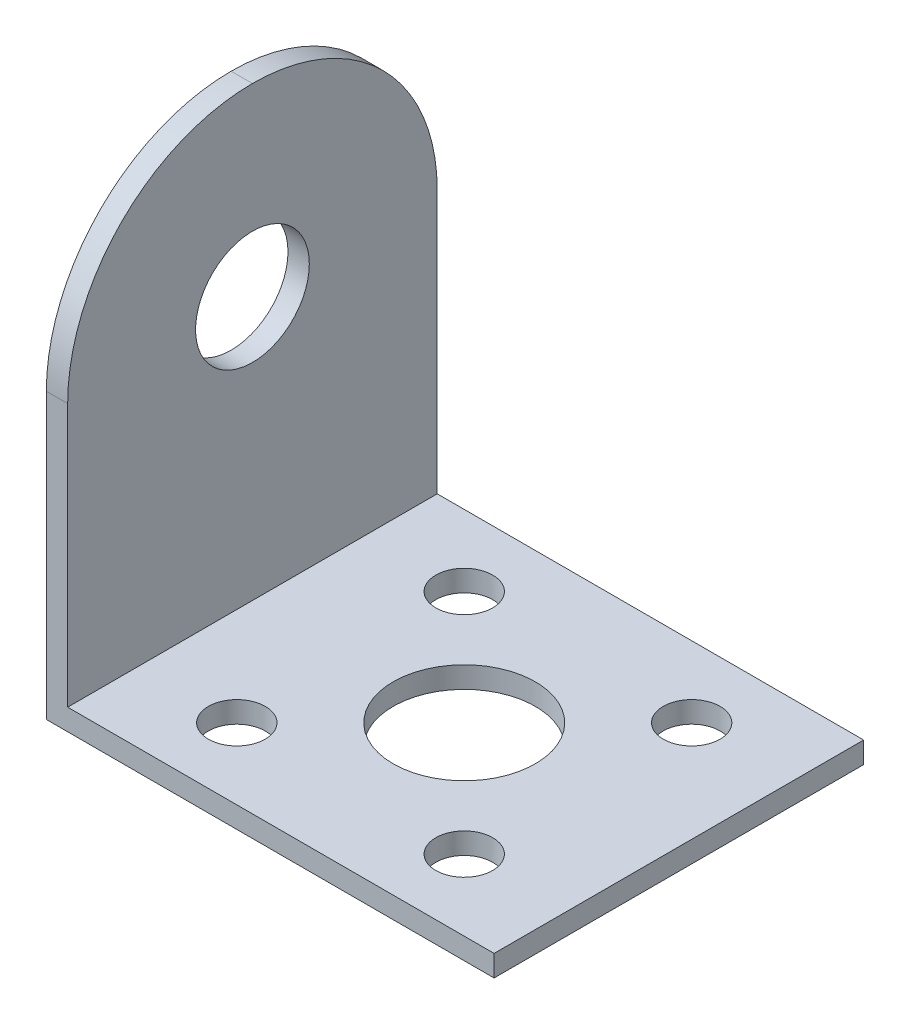
ISO-10303-21;
HEADER;
FILE_DESCRIPTION(('STEP AP214'),'2;1');
FILE_NAME('part.step','',(''),(''),'','','');
FILE_SCHEMA(('AUTOMOTIVE_DESIGN { 1 0 10303 214 1 1 1 1 }'));
ENDSEC;
DATA;
#1=APPLICATION_CONTEXT('core data for automotive mechanical design processes');
#2=APPLICATION_PROTOCOL_DEFINITION('international standard','automotive_design',2000,#1);
#3=PRODUCT_CONTEXT('',#1,'mechanical');
#4=PRODUCT('Part','Part','',(#3));
#5=PRODUCT_RELATED_PRODUCT_CATEGORY('part','',(#4));
#6=PRODUCT_DEFINITION_FORMATION('','',#4);
#7=PRODUCT_DEFINITION_CONTEXT('part definition',#1,'design');
#8=PRODUCT_DEFINITION('design','',#6,#7);
#9=PRODUCT_DEFINITION_SHAPE('','',#8);
#10=(LENGTH_UNIT() NAMED_UNIT(*) SI_UNIT(.MILLI.,.METRE.));
#11=(NAMED_UNIT(*) PLANE_ANGLE_UNIT() SI_UNIT($,.RADIAN.));
#12=(NAMED_UNIT(*) SI_UNIT($,.STERADIAN.) SOLID_ANGLE_UNIT());
#13=UNCERTAINTY_MEASURE_WITH_UNIT(LENGTH_MEASURE(1.E-05),#10,'distance_accuracy_value','');
#14=(GEOMETRIC_REPRESENTATION_CONTEXT(3) GLOBAL_UNCERTAINTY_ASSIGNED_CONTEXT((#13)) GLOBAL_UNIT_ASSIGNED_CONTEXT((#10,
#11,#12)) REPRESENTATION_CONTEXT('',''));
#15=CARTESIAN_POINT('',(0.,0.,0.));
#16=DIRECTION('',(0.,0.,1.));
#17=DIRECTION('',(1.,0.,0.));
#18=AXIS2_PLACEMENT_3D('',#15,#16,#17);
#19=CARTESIAN_POINT('',(0.,-1.5,0.));
#20=DIRECTION('',(0.,1.,0.));
#21=DIRECTION('',(0.,0.,1.));
#22=AXIS2_PLACEMENT_3D('',#19,#20,#21);
#23=PLANE('',#22);
#24=CARTESIAN_POINT('',(-7.35,-1.5,8.));
#25=DIRECTION('',(0.,1.,0.));
#26=DIRECTION('',(0.,0.,1.));
#27=AXIS2_PLACEMENT_3D('',#24,#25,#26);
#28=CIRCLE('',#27,2.);
#29=CARTESIAN_POINT('',(-7.35,-1.5,10.));
#30=VERTEX_POINT('',#29);
#31=EDGE_CURVE('E212',#30,#30,#28,.T.);
#32=ORIENTED_EDGE('',*,*,#31,.T.);
#33=EDGE_LOOP('',(#32));
#34=FACE_BOUND('',#33,.T.);
#35=CARTESIAN_POINT('',(0.650000000000001,-1.5,0.));
#36=DIRECTION('',(0.,1.,0.));
#37=DIRECTION('',(0.,0.,1.));
#38=AXIS2_PLACEMENT_3D('',#35,#36,#37);
#39=CIRCLE('',#38,5.);
#40=CARTESIAN_POINT('',(0.650000000000001,-1.5,5.));
#41=VERTEX_POINT('',#40);
#42=EDGE_CURVE('E213',#41,#41,#39,.T.);
#43=ORIENTED_EDGE('',*,*,#42,.T.);
#44=EDGE_LOOP('',(#43));
#45=FACE_BOUND('',#44,.T.);
#46=CARTESIAN_POINT('',(8.65,-1.5,-7.99999999999999));
#47=DIRECTION('',(0.,1.,0.));
#48=DIRECTION('',(0.,0.,1.));
#49=AXIS2_PLACEMENT_3D('',#46,#47,#48);
#50=CIRCLE('',#49,2.);
#51=CARTESIAN_POINT('',(8.65,-1.5,-5.99999999999999));
#52=VERTEX_POINT('',#51);
#53=EDGE_CURVE('E406',#52,#52,#50,.T.);
#54=ORIENTED_EDGE('',*,*,#53,.T.);
#55=EDGE_LOOP('',(#54));
#56=FACE_BOUND('',#55,.T.);
#57=DIRECTION('',(0.,0.,-1.));
#58=VECTOR('',#57,1.);
#59=CARTESIAN_POINT('',(15.75,-1.5,-13.));
#60=LINE('',#59,#58);
#61=CARTESIAN_POINT('',(15.75,-1.5,13.));
#62=VERTEX_POINT('',#61);
#63=CARTESIAN_POINT('',(15.75,-1.5,-13.));
#64=VERTEX_POINT('',#63);
#65=EDGE_CURVE('E133',#62,#64,#60,.T.);
#66=ORIENTED_EDGE('',*,*,#65,.F.);
#67=DIRECTION('',(1.,0.,0.));
#68=VECTOR('',#67,1.);
#69=CARTESIAN_POINT('',(-15.75,-1.5,13.));
#70=LINE('',#69,#68);
#71=CARTESIAN_POINT('',(-15.75,-1.5,13.));
#72=VERTEX_POINT('',#71);
#73=EDGE_CURVE('E145',#72,#62,#70,.T.);
#74=ORIENTED_EDGE('',*,*,#73,.F.);
#75=DIRECTION('',(0.,0.,1.));
#76=VECTOR('',#75,1.);
#77=CARTESIAN_POINT('',(-15.75,-1.5,-13.));
#78=LINE('',#77,#76);
#79=CARTESIAN_POINT('',(-15.75,-1.5,-13.));
#80=VERTEX_POINT('',#79);
#81=EDGE_CURVE('E141',#80,#72,#78,.T.);
#82=ORIENTED_EDGE('',*,*,#81,.F.);
#83=DIRECTION('',(-1.,0.,0.));
#84=VECTOR('',#83,1.);
#85=CARTESIAN_POINT('',(-15.75,-1.5,-13.));
#86=LINE('',#85,#84);
#87=EDGE_CURVE('E137',#64,#80,#86,.T.);
#88=ORIENTED_EDGE('',*,*,#87,.F.);
#89=EDGE_LOOP('',(#66,#74,#82,#88));
#90=FACE_BOUND('',#89,.T.);
#91=CARTESIAN_POINT('',(8.65000000000001,-1.5,8.));
#92=DIRECTION('',(0.,1.,0.));
#93=DIRECTION('',(0.,0.,1.));
#94=AXIS2_PLACEMENT_3D('',#91,#92,#93);
#95=CIRCLE('',#94,2.);
#96=CARTESIAN_POINT('',(8.65000000000001,-1.5,10.));
#97=VERTEX_POINT('',#96);
#98=EDGE_CURVE('E206',#97,#97,#95,.F.);
#99=ORIENTED_EDGE('',*,*,#98,.F.);
#100=EDGE_LOOP('',(#99));
#101=FACE_BOUND('',#100,.T.);
#102=CARTESIAN_POINT('',(-7.35,-1.5,-8.));
#103=DIRECTION('',(0.,1.,0.));
#104=DIRECTION('',(0.,0.,1.));
#105=AXIS2_PLACEMENT_3D('',#102,#103,#104);
#106=CIRCLE('',#105,2.);
#107=CARTESIAN_POINT('',(-7.35,-1.5,-6.));
#108=VERTEX_POINT('',#107);
#109=EDGE_CURVE('E209',#108,#108,#106,.F.);
#110=ORIENTED_EDGE('',*,*,#109,.F.);
#111=EDGE_LOOP('',(#110));
#112=FACE_BOUND('',#111,.T.);
#113=ADVANCED_FACE('F42',(#34,#45,#56,#90,#101,#112),#23,.F.);
#114=CARTESIAN_POINT('',(0.,0.,0.));
#115=DIRECTION('',(0.,1.,0.));
#116=DIRECTION('',(0.,0.,1.));
#117=AXIS2_PLACEMENT_3D('',#114,#115,#116);
#118=PLANE('',#117);
#119=CARTESIAN_POINT('',(-7.35,0.,8.));
#120=DIRECTION('',(0.,1.,0.));
#121=DIRECTION('',(0.,0.,1.));
#122=AXIS2_PLACEMENT_3D('',#119,#120,#121);
#123=CIRCLE('',#122,2.);
#124=CARTESIAN_POINT('',(-7.35,0.,10.));
#125=VERTEX_POINT('',#124);
#126=EDGE_CURVE('E399',#125,#125,#123,.T.);
#127=ORIENTED_EDGE('',*,*,#126,.F.);
#128=EDGE_LOOP('',(#127));
#129=FACE_BOUND('',#128,.T.);
#130=CARTESIAN_POINT('',(8.65000000000001,0.,8.));
#131=DIRECTION('',(0.,1.,0.));
#132=DIRECTION('',(0.,0.,1.));
#133=AXIS2_PLACEMENT_3D('',#130,#131,#132);
#134=CIRCLE('',#133,2.);
#135=CARTESIAN_POINT('',(8.65000000000001,0.,10.));
#136=VERTEX_POINT('',#135);
#137=EDGE_CURVE('E414',#136,#136,#134,.F.);
#138=ORIENTED_EDGE('',*,*,#137,.T.);
#139=EDGE_LOOP('',(#138));
#140=FACE_BOUND('',#139,.T.);
#141=CARTESIAN_POINT('',(8.65,0.,-7.99999999999999));
#142=DIRECTION('',(0.,1.,0.));
#143=DIRECTION('',(0.,0.,1.));
#144=AXIS2_PLACEMENT_3D('',#141,#142,#143);
#145=CIRCLE('',#144,2.);
#146=CARTESIAN_POINT('',(8.65,0.,-5.99999999999999));
#147=VERTEX_POINT('',#146);
#148=EDGE_CURVE('E409',#147,#147,#145,.T.);
#149=ORIENTED_EDGE('',*,*,#148,.F.);
#150=EDGE_LOOP('',(#149));
#151=FACE_BOUND('',#150,.T.);
#152=DIRECTION('',(0.,0.,-1.));
#153=VECTOR('',#152,1.);
#154=CARTESIAN_POINT('',(-14.25,0.,-13.));
#155=LINE('',#154,#153);
#156=CARTESIAN_POINT('',(-14.25,0.,13.));
#157=VERTEX_POINT('',#156);
#158=CARTESIAN_POINT('',(-14.25,0.,-13.));
#159=VERTEX_POINT('',#158);
#160=EDGE_CURVE('E108',#157,#159,#155,.T.);
#161=ORIENTED_EDGE('',*,*,#160,.F.);
#162=DIRECTION('',(1.,0.,0.));
#163=VECTOR('',#162,1.);
#164=CARTESIAN_POINT('',(-15.75,0.,13.));
#165=LINE('',#164,#163);
#166=CARTESIAN_POINT('',(15.75,0.,13.));
#167=VERTEX_POINT('',#166);
#168=EDGE_CURVE('E118',#157,#167,#165,.T.);
#169=ORIENTED_EDGE('',*,*,#168,.T.);
#170=DIRECTION('',(0.,0.,-1.));
#171=VECTOR('',#170,1.);
#172=CARTESIAN_POINT('',(15.75,0.,-13.));
#173=LINE('',#172,#171);
#174=CARTESIAN_POINT('',(15.75,0.,-13.));
#175=VERTEX_POINT('',#174);
#176=EDGE_CURVE('E116',#167,#175,#173,.T.);
#177=ORIENTED_EDGE('',*,*,#176,.T.);
#178=DIRECTION('',(-1.,0.,0.));
#179=VECTOR('',#178,1.);
#180=CARTESIAN_POINT('',(-15.75,0.,-13.));
#181=LINE('',#180,#179);
#182=EDGE_CURVE('E101',#175,#159,#181,.T.);
#183=ORIENTED_EDGE('',*,*,#182,.T.);
#184=EDGE_LOOP('',(#161,#169,#177,#183));
#185=FACE_BOUND('',#184,.T.);
#186=CARTESIAN_POINT('',(0.650000000000001,0.,0.));
#187=DIRECTION('',(0.,1.,0.));
#188=DIRECTION('',(0.,0.,1.));
#189=AXIS2_PLACEMENT_3D('',#186,#187,#188);
#190=CIRCLE('',#189,5.);
#191=CARTESIAN_POINT('',(0.650000000000001,0.,5.));
#192=VERTEX_POINT('',#191);
#193=EDGE_CURVE('E423',#192,#192,#190,.T.);
#194=ORIENTED_EDGE('',*,*,#193,.F.);
#195=EDGE_LOOP('',(#194));
#196=FACE_BOUND('',#195,.T.);
#197=CARTESIAN_POINT('',(-7.35,0.,-8.));
#198=DIRECTION('',(0.,-1.,0.));
#199=DIRECTION('',(0.,0.,-1.));
#200=AXIS2_PLACEMENT_3D('',#197,#198,#199);
#201=CIRCLE('',#200,2.);
#202=CARTESIAN_POINT('',(-7.35,0.,-10.));
#203=VERTEX_POINT('',#202);
#204=EDGE_CURVE('E419',#203,#203,#201,.T.);
#205=ORIENTED_EDGE('',*,*,#204,.T.);
#206=EDGE_LOOP('',(#205));
#207=FACE_BOUND('',#206,.T.);
#208=ADVANCED_FACE('F112',(#129,#140,#151,#185,#196,#207),#118,.T.);
#209=CARTESIAN_POINT('',(15.75,-1.5,-13.));
#210=DIRECTION('',(1.,0.,0.));
#211=DIRECTION('',(0.,0.,-1.));
#212=AXIS2_PLACEMENT_3D('',#209,#210,#211);
#213=PLANE('',#212);
#214=ORIENTED_EDGE('',*,*,#176,.F.);
#215=DIRECTION('',(0.,1.,0.));
#216=VECTOR('',#215,1.);
#217=CARTESIAN_POINT('',(15.75,-1.5,13.));
#218=LINE('',#217,#216);
#219=EDGE_CURVE('E154',#62,#167,#218,.T.);
#220=ORIENTED_EDGE('',*,*,#219,.F.);
#221=ORIENTED_EDGE('',*,*,#65,.T.);
#222=DIRECTION('',(0.,1.,0.));
#223=VECTOR('',#222,1.);
#224=CARTESIAN_POINT('',(15.75,-1.5,-13.));
#225=LINE('',#224,#223);
#226=EDGE_CURVE('E149',#64,#175,#225,.T.);
#227=ORIENTED_EDGE('',*,*,#226,.T.);
#228=EDGE_LOOP('',(#214,#220,#221,#227));
#229=FACE_BOUND('',#228,.T.);
#230=ADVANCED_FACE('F195',(#229),#213,.T.);
#231=CARTESIAN_POINT('',(-15.75,-1.5,13.));
#232=DIRECTION('',(0.,0.,1.));
#233=DIRECTION('',(1.,0.,0.));
#234=AXIS2_PLACEMENT_3D('',#231,#232,#233);
#235=PLANE('',#234);
#236=DIRECTION('',(0.,-1.,0.));
#237=VECTOR('',#236,1.);
#238=CARTESIAN_POINT('',(-14.25,31.5,13.));
#239=LINE('',#238,#237);
#240=CARTESIAN_POINT('',(-14.25,18.5,13.));
#241=VERTEX_POINT('',#240);
#242=EDGE_CURVE('E107',#241,#157,#239,.T.);
#243=ORIENTED_EDGE('',*,*,#242,.F.);
#244=DIRECTION('',(1.,0.,0.));
#245=VECTOR('',#244,1.);
#246=CARTESIAN_POINT('',(-15.75,18.5,13.));
#247=LINE('',#246,#245);
#248=CARTESIAN_POINT('',(-15.75,18.5,13.));
#249=VERTEX_POINT('',#248);
#250=EDGE_CURVE('E174',#241,#249,#247,.F.);
#251=ORIENTED_EDGE('',*,*,#250,.T.);
#252=DIRECTION('',(0.,1.,0.));
#253=VECTOR('',#252,1.);
#254=CARTESIAN_POINT('',(-15.75,-1.5,13.));
#255=LINE('',#254,#253);
#256=EDGE_CURVE('E159',#72,#249,#255,.T.);
#257=ORIENTED_EDGE('',*,*,#256,.F.);
#258=ORIENTED_EDGE('',*,*,#73,.T.);
#259=ORIENTED_EDGE('',*,*,#219,.T.);
#260=ORIENTED_EDGE('',*,*,#168,.F.);
#261=EDGE_LOOP('',(#243,#251,#257,#258,#259,#260));
#262=FACE_BOUND('',#261,.T.);
#263=ADVANCED_FACE('F191',(#262),#235,.T.);
#264=CARTESIAN_POINT('',(-15.75,-1.5,-13.));
#265=DIRECTION('',(-1.,0.,0.));
#266=DIRECTION('',(0.,0.,1.));
#267=AXIS2_PLACEMENT_3D('',#264,#265,#266);
#268=PLANE('',#267);
#269=CARTESIAN_POINT('',(-15.75,18.5,0.));
#270=DIRECTION('',(-1.,0.,0.));
#271=DIRECTION('',(0.,0.,1.));
#272=AXIS2_PLACEMENT_3D('',#269,#270,#271);
#273=CIRCLE('',#272,4.);
#274=CARTESIAN_POINT('',(-15.75,18.5,4.));
#275=VERTEX_POINT('',#274);
#276=EDGE_CURVE('E123',#275,#275,#273,.T.);
#277=ORIENTED_EDGE('',*,*,#276,.F.);
#278=EDGE_LOOP('',(#277));
#279=FACE_BOUND('',#278,.T.);
#280=CARTESIAN_POINT('',(-15.75,18.5,0.));
#281=DIRECTION('',(-1.,0.,0.));
#282=DIRECTION('',(0.,0.,1.));
#283=AXIS2_PLACEMENT_3D('',#280,#281,#282);
#284=CIRCLE('',#283,13.);
#285=CARTESIAN_POINT('',(-15.75,31.5,0.));
#286=VERTEX_POINT('',#285);
#287=EDGE_CURVE('E177',#249,#286,#284,.T.);
#288=ORIENTED_EDGE('',*,*,#287,.T.);
#289=CARTESIAN_POINT('',(-15.75,18.5,0.));
#290=DIRECTION('',(-1.,0.,0.));
#291=DIRECTION('',(0.,0.,1.));
#292=AXIS2_PLACEMENT_3D('',#289,#290,#291);
#293=CIRCLE('',#292,13.);
#294=CARTESIAN_POINT('',(-15.75,18.5,-13.));
#295=VERTEX_POINT('',#294);
#296=EDGE_CURVE('E65',#286,#295,#293,.T.);
#297=ORIENTED_EDGE('',*,*,#296,.T.);
#298=DIRECTION('',(0.,1.,0.));
#299=VECTOR('',#298,1.);
#300=CARTESIAN_POINT('',(-15.75,-1.5,-13.));
#301=LINE('',#300,#299);
#302=EDGE_CURVE('E163',#80,#295,#301,.T.);
#303=ORIENTED_EDGE('',*,*,#302,.F.);
#304=ORIENTED_EDGE('',*,*,#81,.T.);
#305=ORIENTED_EDGE('',*,*,#256,.T.);
#306=EDGE_LOOP('',(#288,#297,#303,#304,#305));
#307=FACE_BOUND('',#306,.T.);
#308=ADVANCED_FACE('F184',(#279,#307),#268,.T.);
#309=CARTESIAN_POINT('',(-15.75,-1.5,-13.));
#310=DIRECTION('',(0.,0.,-1.));
#311=DIRECTION('',(-1.,0.,0.));
#312=AXIS2_PLACEMENT_3D('',#309,#310,#311);
#313=PLANE('',#312);
#314=ORIENTED_EDGE('',*,*,#302,.T.);
#315=DIRECTION('',(-1.,0.,0.));
#316=VECTOR('',#315,1.);
#317=CARTESIAN_POINT('',(-15.75,18.5,-13.));
#318=LINE('',#317,#316);
#319=CARTESIAN_POINT('',(-14.25,18.5,-13.));
#320=VERTEX_POINT('',#319);
#321=EDGE_CURVE('E51',#295,#320,#318,.F.);
#322=ORIENTED_EDGE('',*,*,#321,.T.);
#323=DIRECTION('',(0.,-1.,0.));
#324=VECTOR('',#323,1.);
#325=CARTESIAN_POINT('',(-14.25,31.5,-13.));
#326=LINE('',#325,#324);
#327=EDGE_CURVE('E98',#320,#159,#326,.T.);
#328=ORIENTED_EDGE('',*,*,#327,.T.);
#329=ORIENTED_EDGE('',*,*,#182,.F.);
#330=ORIENTED_EDGE('',*,*,#226,.F.);
#331=ORIENTED_EDGE('',*,*,#87,.T.);
#332=EDGE_LOOP('',(#314,#322,#328,#329,#330,#331));
#333=FACE_BOUND('',#332,.T.);
#334=ADVANCED_FACE('F100',(#333),#313,.T.);
#335=CARTESIAN_POINT('',(-14.25,31.5,-13.));
#336=DIRECTION('',(-1.,0.,0.));
#337=DIRECTION('',(0.,0.,1.));
#338=AXIS2_PLACEMENT_3D('',#335,#336,#337);
#339=PLANE('',#338);
#340=CARTESIAN_POINT('',(-14.25,18.5,0.));
#341=DIRECTION('',(1.,0.,0.));
#342=DIRECTION('',(0.,0.,-1.));
#343=AXIS2_PLACEMENT_3D('',#340,#341,#342);
#344=CIRCLE('',#343,4.);
#345=CARTESIAN_POINT('',(-14.25,18.5,-4.));
#346=VERTEX_POINT('',#345);
#347=EDGE_CURVE('E127',#346,#346,#344,.T.);
#348=ORIENTED_EDGE('',*,*,#347,.F.);
#349=EDGE_LOOP('',(#348));
#350=FACE_BOUND('',#349,.T.);
#351=ORIENTED_EDGE('',*,*,#327,.F.);
#352=CARTESIAN_POINT('',(-14.25,18.5,0.));
#353=DIRECTION('',(-1.,0.,0.));
#354=DIRECTION('',(0.,0.,1.));
#355=AXIS2_PLACEMENT_3D('',#352,#353,#354);
#356=CIRCLE('',#355,13.);
#357=CARTESIAN_POINT('',(-14.25,31.5,0.));
#358=VERTEX_POINT('',#357);
#359=EDGE_CURVE('E11',#320,#358,#356,.F.);
#360=ORIENTED_EDGE('',*,*,#359,.T.);
#361=CARTESIAN_POINT('',(-14.25,18.5,0.));
#362=DIRECTION('',(-1.,0.,0.));
#363=DIRECTION('',(0.,0.,1.));
#364=AXIS2_PLACEMENT_3D('',#361,#362,#363);
#365=CIRCLE('',#364,13.);
#366=EDGE_CURVE('E171',#358,#241,#365,.F.);
#367=ORIENTED_EDGE('',*,*,#366,.T.);
#368=ORIENTED_EDGE('',*,*,#242,.T.);
#369=ORIENTED_EDGE('',*,*,#160,.T.);
#370=EDGE_LOOP('',(#351,#360,#367,#368,#369));
#371=FACE_BOUND('',#370,.T.);
#372=ADVANCED_FACE('F120',(#350,#371),#339,.F.);
#373=CARTESIAN_POINT('',(0.,18.5,0.));
#374=DIRECTION('',(1.,0.,0.));
#375=DIRECTION('',(0.,0.,-1.));
#376=AXIS2_PLACEMENT_3D('',#373,#374,#375);
#377=CYLINDRICAL_SURFACE('',#376,13.);
#378=ORIENTED_EDGE('',*,*,#287,.F.);
#379=ORIENTED_EDGE('',*,*,#250,.F.);
#380=ORIENTED_EDGE('',*,*,#366,.F.);
#381=DIRECTION('',(1.,0.,0.));
#382=VECTOR('',#381,1.);
#383=CARTESIAN_POINT('',(0.,31.5,0.));
#384=LINE('',#383,#382);
#385=EDGE_CURVE('E158',#286,#358,#384,.T.);
#386=ORIENTED_EDGE('',*,*,#385,.F.);
#387=EDGE_LOOP('',(#378,#379,#380,#386));
#388=FACE_BOUND('',#387,.T.);
#389=ADVANCED_FACE('F188',(#388),#377,.T.);
#390=CARTESIAN_POINT('',(0.,18.5,0.));
#391=DIRECTION('',(-1.,0.,0.));
#392=DIRECTION('',(0.,0.,1.));
#393=AXIS2_PLACEMENT_3D('',#390,#391,#392);
#394=CYLINDRICAL_SURFACE('',#393,13.);
#395=ORIENTED_EDGE('',*,*,#359,.F.);
#396=ORIENTED_EDGE('',*,*,#321,.F.);
#397=ORIENTED_EDGE('',*,*,#296,.F.);
#398=ORIENTED_EDGE('',*,*,#385,.T.);
#399=EDGE_LOOP('',(#395,#396,#397,#398));
#400=FACE_BOUND('',#399,.T.);
#401=ADVANCED_FACE('F44',(#400),#394,.T.);
#402=CARTESIAN_POINT('',(-45.75,18.5,0.));
#403=DIRECTION('',(1.,0.,0.));
#404=DIRECTION('',(0.,0.,-1.));
#405=AXIS2_PLACEMENT_3D('',#402,#403,#404);
#406=CYLINDRICAL_SURFACE('',#405,4.);
#407=ORIENTED_EDGE('',*,*,#276,.T.);
#408=EDGE_LOOP('',(#407));
#409=FACE_BOUND('',#408,.T.);
#410=ORIENTED_EDGE('',*,*,#347,.T.);
#411=EDGE_LOOP('',(#410));
#412=FACE_BOUND('',#411,.T.);
#413=ADVANCED_FACE('F226',(#409,#412),#406,.F.);
#414=CARTESIAN_POINT('',(8.65,-10.,-7.99999999999999));
#415=DIRECTION('',(0.,1.,0.));
#416=DIRECTION('',(0.,0.,1.));
#417=AXIS2_PLACEMENT_3D('',#414,#415,#416);
#418=CYLINDRICAL_SURFACE('',#417,2.);
#419=ORIENTED_EDGE('',*,*,#148,.T.);
#420=EDGE_LOOP('',(#419));
#421=FACE_BOUND('',#420,.T.);
#422=ORIENTED_EDGE('',*,*,#53,.F.);
#423=EDGE_LOOP('',(#422));
#424=FACE_BOUND('',#423,.T.);
#425=ADVANCED_FACE('F289',(#421,#424),#418,.F.);
#426=CARTESIAN_POINT('',(8.65000000000001,-10.,8.));
#427=DIRECTION('',(0.,1.,0.));
#428=DIRECTION('',(0.,0.,1.));
#429=AXIS2_PLACEMENT_3D('',#426,#427,#428);
#430=CYLINDRICAL_SURFACE('',#429,2.);
#431=ORIENTED_EDGE('',*,*,#137,.F.);
#432=EDGE_LOOP('',(#431));
#433=FACE_BOUND('',#432,.T.);
#434=ORIENTED_EDGE('',*,*,#98,.T.);
#435=EDGE_LOOP('',(#434));
#436=FACE_BOUND('',#435,.T.);
#437=ADVANCED_FACE('F299',(#433,#436),#430,.F.);
#438=CARTESIAN_POINT('',(0.650000000000001,-10.,0.));
#439=DIRECTION('',(0.,1.,0.));
#440=DIRECTION('',(0.,0.,1.));
#441=AXIS2_PLACEMENT_3D('',#438,#439,#440);
#442=CYLINDRICAL_SURFACE('',#441,5.);
#443=ORIENTED_EDGE('',*,*,#193,.T.);
#444=EDGE_LOOP('',(#443));
#445=FACE_BOUND('',#444,.T.);
#446=ORIENTED_EDGE('',*,*,#42,.F.);
#447=EDGE_LOOP('',(#446));
#448=FACE_BOUND('',#447,.T.);
#449=ADVANCED_FACE('F309',(#445,#448),#442,.F.);
#450=CARTESIAN_POINT('',(-7.35,-10.,-8.));
#451=DIRECTION('',(0.,1.,0.));
#452=DIRECTION('',(0.,0.,1.));
#453=AXIS2_PLACEMENT_3D('',#450,#451,#452);
#454=CYLINDRICAL_SURFACE('',#453,2.);
#455=ORIENTED_EDGE('',*,*,#204,.F.);
#456=EDGE_LOOP('',(#455));
#457=FACE_BOUND('',#456,.T.);
#458=ORIENTED_EDGE('',*,*,#109,.T.);
#459=EDGE_LOOP('',(#458));
#460=FACE_BOUND('',#459,.T.);
#461=ADVANCED_FACE('F319',(#457,#460),#454,.F.);
#462=CARTESIAN_POINT('',(-7.35,-10.,8.));
#463=DIRECTION('',(0.,1.,0.));
#464=DIRECTION('',(0.,0.,1.));
#465=AXIS2_PLACEMENT_3D('',#462,#463,#464);
#466=CYLINDRICAL_SURFACE('',#465,2.);
#467=ORIENTED_EDGE('',*,*,#126,.T.);
#468=EDGE_LOOP('',(#467));
#469=FACE_BOUND('',#468,.T.);
#470=ORIENTED_EDGE('',*,*,#31,.F.);
#471=EDGE_LOOP('',(#470));
#472=FACE_BOUND('',#471,.T.);
#473=ADVANCED_FACE('F329',(#469,#472),#466,.F.);
#474=CLOSED_SHELL('',(#113,#208,#230,#263,#308,#334,#372,#389,#401,#413,#425,#437,#449,#461,#473));
#475=MANIFOLD_SOLID_BREP('B2',#474);
#476=ADVANCED_BREP_SHAPE_REPRESENTATION('',(#18,#475),#14);
#477=SHAPE_DEFINITION_REPRESENTATION(#9,#476);
ENDSEC;
END-ISO-10303-21;
